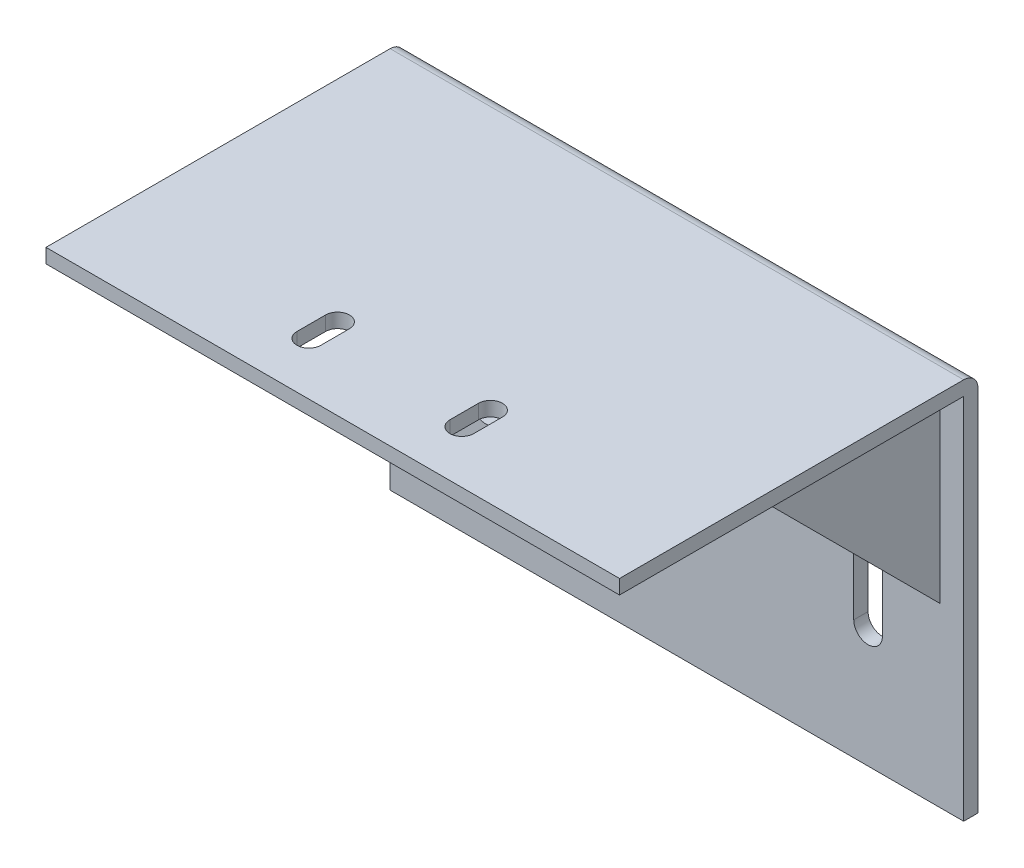
ISO-10303-21;
HEADER;
FILE_DESCRIPTION(('STEP AP214'),'2;1');
FILE_NAME('part.step','',(''),(''),'','','');
FILE_SCHEMA(('AUTOMOTIVE_DESIGN { 1 0 10303 214 1 1 1 1 }'));
ENDSEC;
DATA;
#1=APPLICATION_CONTEXT('core data for automotive mechanical design processes');
#2=APPLICATION_PROTOCOL_DEFINITION('international standard','automotive_design',2000,#1);
#3=PRODUCT_CONTEXT('',#1,'mechanical');
#4=PRODUCT('Part','Part','',(#3));
#5=PRODUCT_RELATED_PRODUCT_CATEGORY('part','',(#4));
#6=PRODUCT_DEFINITION_FORMATION('','',#4);
#7=PRODUCT_DEFINITION_CONTEXT('part definition',#1,'design');
#8=PRODUCT_DEFINITION('design','',#6,#7);
#9=PRODUCT_DEFINITION_SHAPE('','',#8);
#10=(LENGTH_UNIT() NAMED_UNIT(*) SI_UNIT(.MILLI.,.METRE.));
#11=(NAMED_UNIT(*) PLANE_ANGLE_UNIT() SI_UNIT($,.RADIAN.));
#12=(NAMED_UNIT(*) SI_UNIT($,.STERADIAN.) SOLID_ANGLE_UNIT());
#13=UNCERTAINTY_MEASURE_WITH_UNIT(LENGTH_MEASURE(1.E-05),#10,'distance_accuracy_value','');
#14=(GEOMETRIC_REPRESENTATION_CONTEXT(3) GLOBAL_UNCERTAINTY_ASSIGNED_CONTEXT((#13)) GLOBAL_UNIT_ASSIGNED_CONTEXT((#10,
#11,#12)) REPRESENTATION_CONTEXT('',''));
#15=CARTESIAN_POINT('',(0.,0.,0.));
#16=DIRECTION('',(0.,0.,1.));
#17=DIRECTION('',(1.,0.,0.));
#18=AXIS2_PLACEMENT_3D('',#15,#16,#17);
#19=CARTESIAN_POINT('',(0.,0.,3.));
#20=DIRECTION('',(0.,0.,-1.));
#21=DIRECTION('',(-1.,0.,0.));
#22=AXIS2_PLACEMENT_3D('',#19,#20,#21);
#23=PLANE('',#22);
#24=CARTESIAN_POINT('',(20.,25.,3.));
#25=DIRECTION('',(0.,0.,1.));
#26=DIRECTION('',(1.,0.,0.));
#27=AXIS2_PLACEMENT_3D('',#24,#25,#26);
#28=CIRCLE('',#27,3.);
#29=CARTESIAN_POINT('',(17.,25.,3.));
#30=VERTEX_POINT('',#29);
#31=CARTESIAN_POINT('',(23.,25.,3.));
#32=VERTEX_POINT('',#31);
#33=EDGE_CURVE('E288',#30,#32,#28,.T.);
#34=ORIENTED_EDGE('',*,*,#33,.F.);
#35=DIRECTION('',(0.,-1.,0.));
#36=VECTOR('',#35,1.);
#37=CARTESIAN_POINT('',(17.,55.,3.));
#38=LINE('',#37,#36);
#39=CARTESIAN_POINT('',(17.,55.,3.));
#40=VERTEX_POINT('',#39);
#41=EDGE_CURVE('E286',#40,#30,#38,.T.);
#42=ORIENTED_EDGE('',*,*,#41,.F.);
#43=CARTESIAN_POINT('',(20.,55.,3.));
#44=DIRECTION('',(0.,0.,1.));
#45=DIRECTION('',(1.,0.,0.));
#46=AXIS2_PLACEMENT_3D('',#43,#44,#45);
#47=CIRCLE('',#46,2.99999999999999);
#48=CARTESIAN_POINT('',(23.,55.,3.));
#49=VERTEX_POINT('',#48);
#50=EDGE_CURVE('E277',#49,#40,#47,.T.);
#51=ORIENTED_EDGE('',*,*,#50,.F.);
#52=DIRECTION('',(0.,1.,0.));
#53=VECTOR('',#52,1.);
#54=CARTESIAN_POINT('',(23.,55.,3.));
#55=LINE('',#54,#53);
#56=EDGE_CURVE('E291',#32,#49,#55,.T.);
#57=ORIENTED_EDGE('',*,*,#56,.F.);
#58=EDGE_LOOP('',(#34,#42,#51,#57));
#59=FACE_BOUND('',#58,.T.);
#60=CARTESIAN_POINT('',(100.,25.,3.));
#61=DIRECTION('',(0.,0.,1.));
#62=DIRECTION('',(1.,0.,0.));
#63=AXIS2_PLACEMENT_3D('',#60,#61,#62);
#64=CIRCLE('',#63,3.);
#65=CARTESIAN_POINT('',(97.,25.,3.));
#66=VERTEX_POINT('',#65);
#67=CARTESIAN_POINT('',(103.,24.9999999999999,3.));
#68=VERTEX_POINT('',#67);
#69=EDGE_CURVE('E256',#66,#68,#64,.T.);
#70=ORIENTED_EDGE('',*,*,#69,.F.);
#71=DIRECTION('',(0.,-1.,0.));
#72=VECTOR('',#71,1.);
#73=CARTESIAN_POINT('',(97.,55.,3.));
#74=LINE('',#73,#72);
#75=CARTESIAN_POINT('',(97.,55.,3.));
#76=VERTEX_POINT('',#75);
#77=EDGE_CURVE('E254',#76,#66,#74,.T.);
#78=ORIENTED_EDGE('',*,*,#77,.F.);
#79=CARTESIAN_POINT('',(100.,55.,3.));
#80=DIRECTION('',(0.,0.,1.));
#81=DIRECTION('',(1.,0.,0.));
#82=AXIS2_PLACEMENT_3D('',#79,#80,#81);
#83=CIRCLE('',#82,3.);
#84=CARTESIAN_POINT('',(103.,55.,3.));
#85=VERTEX_POINT('',#84);
#86=EDGE_CURVE('E249',#85,#76,#83,.T.);
#87=ORIENTED_EDGE('',*,*,#86,.F.);
#88=DIRECTION('',(0.,1.,0.));
#89=VECTOR('',#88,1.);
#90=CARTESIAN_POINT('',(103.,55.,3.));
#91=LINE('',#90,#89);
#92=EDGE_CURVE('E259',#68,#85,#91,.T.);
#93=ORIENTED_EDGE('',*,*,#92,.F.);
#94=EDGE_LOOP('',(#70,#78,#87,#93));
#95=FACE_BOUND('',#94,.T.);
#96=DIRECTION('',(0.,1.,0.));
#97=VECTOR('',#96,1.);
#98=CARTESIAN_POINT('',(115.,77.,3.));
#99=LINE('',#98,#97);
#100=CARTESIAN_POINT('',(115.,37.,3.));
#101=VERTEX_POINT('',#100);
#102=CARTESIAN_POINT('',(115.,77.,3.));
#103=VERTEX_POINT('',#102);
#104=EDGE_CURVE('E407',#101,#103,#99,.T.);
#105=ORIENTED_EDGE('',*,*,#104,.F.);
#106=DIRECTION('',(1.,0.,0.));
#107=VECTOR('',#106,1.);
#108=CARTESIAN_POINT('',(112.,37.,3.));
#109=LINE('',#108,#107);
#110=CARTESIAN_POINT('',(112.,37.,3.));
#111=VERTEX_POINT('',#110);
#112=EDGE_CURVE('E467',#111,#101,#109,.T.);
#113=ORIENTED_EDGE('',*,*,#112,.F.);
#114=DIRECTION('',(0.,-1.,0.));
#115=VECTOR('',#114,1.);
#116=CARTESIAN_POINT('',(112.,77.,3.));
#117=LINE('',#116,#115);
#118=CARTESIAN_POINT('',(112.,77.,3.));
#119=VERTEX_POINT('',#118);
#120=EDGE_CURVE('E461',#119,#111,#117,.T.);
#121=ORIENTED_EDGE('',*,*,#120,.F.);
#122=DIRECTION('',(1.,0.,0.));
#123=VECTOR('',#122,1.);
#124=CARTESIAN_POINT('',(0.,77.,3.));
#125=LINE('',#124,#123);
#126=CARTESIAN_POINT('',(8.,77.,3.));
#127=VERTEX_POINT('',#126);
#128=EDGE_CURVE('E328',#127,#119,#125,.T.);
#129=ORIENTED_EDGE('',*,*,#128,.F.);
#130=DIRECTION('',(0.,1.,0.));
#131=VECTOR('',#130,1.);
#132=CARTESIAN_POINT('',(8.,77.,3.));
#133=LINE('',#132,#131);
#134=CARTESIAN_POINT('',(8.00000000000001,37.,3.));
#135=VERTEX_POINT('',#134);
#136=EDGE_CURVE('E234',#135,#127,#133,.T.);
#137=ORIENTED_EDGE('',*,*,#136,.F.);
#138=DIRECTION('',(1.,0.,0.));
#139=VECTOR('',#138,1.);
#140=CARTESIAN_POINT('',(4.99999999999999,37.,3.));
#141=LINE('',#140,#139);
#142=CARTESIAN_POINT('',(4.99999999999999,37.,3.));
#143=VERTEX_POINT('',#142);
#144=EDGE_CURVE('E476',#143,#135,#141,.T.);
#145=ORIENTED_EDGE('',*,*,#144,.F.);
#146=DIRECTION('',(0.,-1.,0.));
#147=VECTOR('',#146,1.);
#148=CARTESIAN_POINT('',(4.99999999999999,77.,3.));
#149=LINE('',#148,#147);
#150=CARTESIAN_POINT('',(4.99999999999999,77.,3.));
#151=VERTEX_POINT('',#150);
#152=EDGE_CURVE('E239',#151,#143,#149,.T.);
#153=ORIENTED_EDGE('',*,*,#152,.F.);
#154=CARTESIAN_POINT('',(0.,77.,3.));
#155=VERTEX_POINT('',#154);
#156=EDGE_CURVE('E246',#155,#151,#125,.T.);
#157=ORIENTED_EDGE('',*,*,#156,.F.);
#158=DIRECTION('',(0.,-1.,0.));
#159=VECTOR('',#158,1.);
#160=CARTESIAN_POINT('',(0.,0.,3.));
#161=LINE('',#160,#159);
#162=CARTESIAN_POINT('',(0.,0.,3.));
#163=VERTEX_POINT('',#162);
#164=EDGE_CURVE('E353',#155,#163,#161,.T.);
#165=ORIENTED_EDGE('',*,*,#164,.T.);
#166=DIRECTION('',(1.,0.,0.));
#167=VECTOR('',#166,1.);
#168=CARTESIAN_POINT('',(0.,0.,3.));
#169=LINE('',#168,#167);
#170=CARTESIAN_POINT('',(120.,0.,3.));
#171=VERTEX_POINT('',#170);
#172=EDGE_CURVE('E355',#163,#171,#169,.T.);
#173=ORIENTED_EDGE('',*,*,#172,.T.);
#174=DIRECTION('',(0.,1.,0.));
#175=VECTOR('',#174,1.);
#176=CARTESIAN_POINT('',(120.,0.,3.));
#177=LINE('',#176,#175);
#178=CARTESIAN_POINT('',(120.,77.,3.));
#179=VERTEX_POINT('',#178);
#180=EDGE_CURVE('E357',#171,#179,#177,.T.);
#181=ORIENTED_EDGE('',*,*,#180,.T.);
#182=EDGE_CURVE('E309',#103,#179,#125,.T.);
#183=ORIENTED_EDGE('',*,*,#182,.F.);
#184=EDGE_LOOP('',(#105,#113,#121,#129,#137,#145,#153,#157,#165,#173,#181,#183));
#185=FACE_BOUND('',#184,.T.);
#186=ADVANCED_FACE('F33',(#59,#95,#185),#23,.F.);
#187=CARTESIAN_POINT('',(0.,77.,75.));
#188=DIRECTION('',(0.,1.,0.));
#189=DIRECTION('',(-1.,0.,0.));
#190=AXIS2_PLACEMENT_3D('',#187,#188,#189);
#191=PLANE('',#190);
#192=DIRECTION('',(0.,0.,-1.));
#193=VECTOR('',#192,1.);
#194=CARTESIAN_POINT('',(41.5,77.,64.));
#195=LINE('',#194,#193);
#196=CARTESIAN_POINT('',(41.5,77.,64.));
#197=VERTEX_POINT('',#196);
#198=CARTESIAN_POINT('',(41.5,77.,58.));
#199=VERTEX_POINT('',#198);
#200=EDGE_CURVE('E699',#197,#199,#195,.T.);
#201=ORIENTED_EDGE('',*,*,#200,.F.);
#202=CARTESIAN_POINT('',(44.,77.,64.));
#203=DIRECTION('',(0.,-1.,0.));
#204=DIRECTION('',(1.,0.,0.));
#205=AXIS2_PLACEMENT_3D('',#202,#203,#204);
#206=CIRCLE('',#205,2.5);
#207=CARTESIAN_POINT('',(46.5,77.,64.));
#208=VERTEX_POINT('',#207);
#209=EDGE_CURVE('E707',#208,#197,#206,.T.);
#210=ORIENTED_EDGE('',*,*,#209,.F.);
#211=DIRECTION('',(0.,0.,1.));
#212=VECTOR('',#211,1.);
#213=CARTESIAN_POINT('',(46.5,77.,64.));
#214=LINE('',#213,#212);
#215=CARTESIAN_POINT('',(46.5,77.,58.));
#216=VERTEX_POINT('',#215);
#217=EDGE_CURVE('E713',#216,#208,#214,.T.);
#218=ORIENTED_EDGE('',*,*,#217,.F.);
#219=CARTESIAN_POINT('',(44.,77.,58.));
#220=DIRECTION('',(0.,-1.,0.));
#221=DIRECTION('',(1.,0.,0.));
#222=AXIS2_PLACEMENT_3D('',#219,#220,#221);
#223=CIRCLE('',#222,2.5);
#224=EDGE_CURVE('E706',#199,#216,#223,.T.);
#225=ORIENTED_EDGE('',*,*,#224,.F.);
#226=EDGE_LOOP('',(#201,#210,#218,#225));
#227=FACE_BOUND('',#226,.T.);
#228=DIRECTION('',(0.,0.,-1.));
#229=VECTOR('',#228,1.);
#230=CARTESIAN_POINT('',(73.5,77.,64.));
#231=LINE('',#230,#229);
#232=CARTESIAN_POINT('',(73.5,77.,64.));
#233=VERTEX_POINT('',#232);
#234=CARTESIAN_POINT('',(73.5,77.,58.));
#235=VERTEX_POINT('',#234);
#236=EDGE_CURVE('E733',#233,#235,#231,.T.);
#237=ORIENTED_EDGE('',*,*,#236,.F.);
#238=CARTESIAN_POINT('',(76.,77.,64.));
#239=DIRECTION('',(0.,-1.,0.));
#240=DIRECTION('',(1.,0.,0.));
#241=AXIS2_PLACEMENT_3D('',#238,#239,#240);
#242=CIRCLE('',#241,2.50000000000002);
#243=CARTESIAN_POINT('',(78.5,77.,64.));
#244=VERTEX_POINT('',#243);
#245=EDGE_CURVE('E727',#244,#233,#242,.T.);
#246=ORIENTED_EDGE('',*,*,#245,.F.);
#247=DIRECTION('',(0.,0.,1.));
#248=VECTOR('',#247,1.);
#249=CARTESIAN_POINT('',(78.5,77.,64.));
#250=LINE('',#249,#248);
#251=CARTESIAN_POINT('',(78.5,77.,58.));
#252=VERTEX_POINT('',#251);
#253=EDGE_CURVE('E739',#252,#244,#250,.T.);
#254=ORIENTED_EDGE('',*,*,#253,.F.);
#255=CARTESIAN_POINT('',(76.,77.,58.));
#256=DIRECTION('',(0.,-1.,0.));
#257=DIRECTION('',(1.,0.,0.));
#258=AXIS2_PLACEMENT_3D('',#255,#256,#257);
#259=CIRCLE('',#258,2.50000000000002);
#260=EDGE_CURVE('E736',#235,#252,#259,.T.);
#261=ORIENTED_EDGE('',*,*,#260,.F.);
#262=EDGE_LOOP('',(#237,#246,#254,#261));
#263=FACE_BOUND('',#262,.T.);
#264=DIRECTION('',(-1.,0.,0.));
#265=VECTOR('',#264,1.);
#266=CARTESIAN_POINT('',(4.99999999999999,77.,43.));
#267=LINE('',#266,#265);
#268=CARTESIAN_POINT('',(8.,77.,43.));
#269=VERTEX_POINT('',#268);
#270=CARTESIAN_POINT('',(4.99999999999999,77.,43.));
#271=VERTEX_POINT('',#270);
#272=EDGE_CURVE('E222',#269,#271,#267,.T.);
#273=ORIENTED_EDGE('',*,*,#272,.F.);
#274=DIRECTION('',(0.,0.,-1.));
#275=VECTOR('',#274,1.);
#276=CARTESIAN_POINT('',(8.,77.,43.));
#277=LINE('',#276,#275);
#278=EDGE_CURVE('E247',#269,#127,#277,.T.);
#279=ORIENTED_EDGE('',*,*,#278,.T.);
#280=ORIENTED_EDGE('',*,*,#128,.T.);
#281=DIRECTION('',(0.,0.,-1.));
#282=VECTOR('',#281,1.);
#283=CARTESIAN_POINT('',(112.,77.,43.));
#284=LINE('',#283,#282);
#285=CARTESIAN_POINT('',(112.,77.,43.));
#286=VERTEX_POINT('',#285);
#287=EDGE_CURVE('E472',#286,#119,#284,.T.);
#288=ORIENTED_EDGE('',*,*,#287,.F.);
#289=DIRECTION('',(-1.,0.,0.));
#290=VECTOR('',#289,1.);
#291=CARTESIAN_POINT('',(112.,77.,43.));
#292=LINE('',#291,#290);
#293=CARTESIAN_POINT('',(115.,77.,43.));
#294=VERTEX_POINT('',#293);
#295=EDGE_CURVE('E470',#294,#286,#292,.T.);
#296=ORIENTED_EDGE('',*,*,#295,.F.);
#297=DIRECTION('',(0.,0.,-1.));
#298=VECTOR('',#297,1.);
#299=CARTESIAN_POINT('',(115.,77.,43.));
#300=LINE('',#299,#298);
#301=EDGE_CURVE('E403',#294,#103,#300,.T.);
#302=ORIENTED_EDGE('',*,*,#301,.T.);
#303=ORIENTED_EDGE('',*,*,#182,.T.);
#304=DIRECTION('',(0.,0.,-1.));
#305=VECTOR('',#304,1.);
#306=CARTESIAN_POINT('',(120.,77.,75.));
#307=LINE('',#306,#305);
#308=CARTESIAN_POINT('',(120.,77.,75.));
#309=VERTEX_POINT('',#308);
#310=EDGE_CURVE('E386',#309,#179,#307,.T.);
#311=ORIENTED_EDGE('',*,*,#310,.F.);
#312=DIRECTION('',(1.,0.,0.));
#313=VECTOR('',#312,1.);
#314=CARTESIAN_POINT('',(0.,77.,75.));
#315=LINE('',#314,#313);
#316=CARTESIAN_POINT('',(0.,77.,75.));
#317=VERTEX_POINT('',#316);
#318=EDGE_CURVE('E388',#317,#309,#315,.T.);
#319=ORIENTED_EDGE('',*,*,#318,.F.);
#320=DIRECTION('',(0.,0.,-1.));
#321=VECTOR('',#320,1.);
#322=CARTESIAN_POINT('',(0.,77.,75.));
#323=LINE('',#322,#321);
#324=EDGE_CURVE('E382',#317,#155,#323,.T.);
#325=ORIENTED_EDGE('',*,*,#324,.T.);
#326=ORIENTED_EDGE('',*,*,#156,.T.);
#327=DIRECTION('',(0.,0.,-1.));
#328=VECTOR('',#327,1.);
#329=CARTESIAN_POINT('',(4.99999999999999,77.,43.));
#330=LINE('',#329,#328);
#331=EDGE_CURVE('E233',#271,#151,#330,.T.);
#332=ORIENTED_EDGE('',*,*,#331,.F.);
#333=EDGE_LOOP('',(#273,#279,#280,#288,#296,#302,#303,#311,#319,#325,#326,#332));
#334=FACE_BOUND('',#333,.T.);
#335=ADVANCED_FACE('F244',(#227,#263,#334),#191,.F.);
#336=CARTESIAN_POINT('',(0.,0.,3.));
#337=DIRECTION('',(1.,0.,0.));
#338=DIRECTION('',(0.,0.,-1.));
#339=AXIS2_PLACEMENT_3D('',#336,#337,#338);
#340=PLANE('',#339);
#341=DIRECTION('',(0.,0.,-1.));
#342=VECTOR('',#341,1.);
#343=CARTESIAN_POINT('',(0.,80.,3.));
#344=LINE('',#343,#342);
#345=CARTESIAN_POINT('',(0.,80.,75.));
#346=VERTEX_POINT('',#345);
#347=CARTESIAN_POINT('',(0.,80.,3.));
#348=VERTEX_POINT('',#347);
#349=EDGE_CURVE('E365',#346,#348,#344,.T.);
#350=ORIENTED_EDGE('',*,*,#349,.T.);
#351=CARTESIAN_POINT('',(0.,77.,3.));
#352=DIRECTION('',(1.,0.,0.));
#353=DIRECTION('',(0.,0.,-1.));
#354=AXIS2_PLACEMENT_3D('',#351,#352,#353);
#355=CIRCLE('',#354,3.);
#356=CARTESIAN_POINT('',(0.,77.,0.));
#357=VERTEX_POINT('',#356);
#358=EDGE_CURVE('E55',#348,#357,#355,.F.);
#359=ORIENTED_EDGE('',*,*,#358,.T.);
#360=DIRECTION('',(0.,-1.,0.));
#361=VECTOR('',#360,1.);
#362=CARTESIAN_POINT('',(0.,0.,0.));
#363=LINE('',#362,#361);
#364=CARTESIAN_POINT('',(0.,0.,0.));
#365=VERTEX_POINT('',#364);
#366=EDGE_CURVE('E381',#357,#365,#363,.T.);
#367=ORIENTED_EDGE('',*,*,#366,.T.);
#368=DIRECTION('',(0.,0.,-1.));
#369=VECTOR('',#368,1.);
#370=CARTESIAN_POINT('',(0.,0.,3.));
#371=LINE('',#370,#369);
#372=EDGE_CURVE('E338',#163,#365,#371,.T.);
#373=ORIENTED_EDGE('',*,*,#372,.F.);
#374=ORIENTED_EDGE('',*,*,#164,.F.);
#375=ORIENTED_EDGE('',*,*,#324,.F.);
#376=DIRECTION('',(0.,-1.,0.));
#377=VECTOR('',#376,1.);
#378=CARTESIAN_POINT('',(0.,80.,75.));
#379=LINE('',#378,#377);
#380=EDGE_CURVE('E319',#346,#317,#379,.T.);
#381=ORIENTED_EDGE('',*,*,#380,.F.);
#382=EDGE_LOOP('',(#350,#359,#367,#373,#374,#375,#381));
#383=FACE_BOUND('',#382,.T.);
#384=ADVANCED_FACE('F35',(#383),#340,.F.);
#385=CARTESIAN_POINT('',(0.,0.,3.));
#386=DIRECTION('',(0.,1.,0.));
#387=DIRECTION('',(0.,0.,1.));
#388=AXIS2_PLACEMENT_3D('',#385,#386,#387);
#389=PLANE('',#388);
#390=DIRECTION('',(1.,0.,0.));
#391=VECTOR('',#390,1.);
#392=CARTESIAN_POINT('',(0.,0.,0.));
#393=LINE('',#392,#391);
#394=CARTESIAN_POINT('',(120.,0.,0.));
#395=VERTEX_POINT('',#394);
#396=EDGE_CURVE('E380',#365,#395,#393,.T.);
#397=ORIENTED_EDGE('',*,*,#396,.T.);
#398=DIRECTION('',(0.,0.,-1.));
#399=VECTOR('',#398,1.);
#400=CARTESIAN_POINT('',(120.,0.,3.));
#401=LINE('',#400,#399);
#402=EDGE_CURVE('E343',#171,#395,#401,.T.);
#403=ORIENTED_EDGE('',*,*,#402,.F.);
#404=ORIENTED_EDGE('',*,*,#172,.F.);
#405=ORIENTED_EDGE('',*,*,#372,.T.);
#406=EDGE_LOOP('',(#397,#403,#404,#405));
#407=FACE_BOUND('',#406,.T.);
#408=ADVANCED_FACE('F408',(#407),#389,.F.);
#409=CARTESIAN_POINT('',(120.,0.,3.));
#410=DIRECTION('',(-1.,0.,0.));
#411=DIRECTION('',(0.,0.,1.));
#412=AXIS2_PLACEMENT_3D('',#409,#410,#411);
#413=PLANE('',#412);
#414=DIRECTION('',(0.,1.,0.));
#415=VECTOR('',#414,1.);
#416=CARTESIAN_POINT('',(120.,0.,0.));
#417=LINE('',#416,#415);
#418=CARTESIAN_POINT('',(120.,77.,0.));
#419=VERTEX_POINT('',#418);
#420=EDGE_CURVE('E356',#395,#419,#417,.T.);
#421=ORIENTED_EDGE('',*,*,#420,.T.);
#422=CARTESIAN_POINT('',(120.,77.,3.));
#423=DIRECTION('',(-1.,0.,0.));
#424=DIRECTION('',(0.,0.,1.));
#425=AXIS2_PLACEMENT_3D('',#422,#423,#424);
#426=CIRCLE('',#425,3.);
#427=CARTESIAN_POINT('',(120.,80.,3.));
#428=VERTEX_POINT('',#427);
#429=EDGE_CURVE('E11',#419,#428,#426,.F.);
#430=ORIENTED_EDGE('',*,*,#429,.T.);
#431=DIRECTION('',(0.,0.,-1.));
#432=VECTOR('',#431,1.);
#433=CARTESIAN_POINT('',(120.,80.,3.));
#434=LINE('',#433,#432);
#435=CARTESIAN_POINT('',(120.,80.,75.));
#436=VERTEX_POINT('',#435);
#437=EDGE_CURVE('E349',#436,#428,#434,.T.);
#438=ORIENTED_EDGE('',*,*,#437,.F.);
#439=DIRECTION('',(0.,1.,0.));
#440=VECTOR('',#439,1.);
#441=CARTESIAN_POINT('',(120.,80.,75.));
#442=LINE('',#441,#440);
#443=EDGE_CURVE('E387',#309,#436,#442,.T.);
#444=ORIENTED_EDGE('',*,*,#443,.F.);
#445=ORIENTED_EDGE('',*,*,#310,.T.);
#446=ORIENTED_EDGE('',*,*,#180,.F.);
#447=ORIENTED_EDGE('',*,*,#402,.T.);
#448=EDGE_LOOP('',(#421,#430,#438,#444,#445,#446,#447));
#449=FACE_BOUND('',#448,.T.);
#450=ADVANCED_FACE('F376',(#449),#413,.F.);
#451=CARTESIAN_POINT('',(0.,80.,3.));
#452=DIRECTION('',(0.,-1.,0.));
#453=DIRECTION('',(1.,0.,0.));
#454=AXIS2_PLACEMENT_3D('',#451,#452,#453);
#455=PLANE('',#454);
#456=DIRECTION('',(0.,0.,1.));
#457=VECTOR('',#456,1.);
#458=CARTESIAN_POINT('',(46.5,80.,64.));
#459=LINE('',#458,#457);
#460=CARTESIAN_POINT('',(46.5,80.,58.));
#461=VERTEX_POINT('',#460);
#462=CARTESIAN_POINT('',(46.5,80.,64.));
#463=VERTEX_POINT('',#462);
#464=EDGE_CURVE('E439',#461,#463,#459,.T.);
#465=ORIENTED_EDGE('',*,*,#464,.T.);
#466=CARTESIAN_POINT('',(44.,80.,64.));
#467=DIRECTION('',(0.,-1.,0.));
#468=DIRECTION('',(1.,0.,0.));
#469=AXIS2_PLACEMENT_3D('',#466,#467,#468);
#470=CIRCLE('',#469,2.5);
#471=CARTESIAN_POINT('',(41.5,80.,64.));
#472=VERTEX_POINT('',#471);
#473=EDGE_CURVE('E715',#463,#472,#470,.T.);
#474=ORIENTED_EDGE('',*,*,#473,.T.);
#475=DIRECTION('',(0.,0.,-1.));
#476=VECTOR('',#475,1.);
#477=CARTESIAN_POINT('',(41.5,80.,64.));
#478=LINE('',#477,#476);
#479=CARTESIAN_POINT('',(41.5,80.,58.));
#480=VERTEX_POINT('',#479);
#481=EDGE_CURVE('E720',#472,#480,#478,.T.);
#482=ORIENTED_EDGE('',*,*,#481,.T.);
#483=CARTESIAN_POINT('',(44.,80.,58.));
#484=DIRECTION('',(0.,-1.,0.));
#485=DIRECTION('',(1.,0.,0.));
#486=AXIS2_PLACEMENT_3D('',#483,#484,#485);
#487=CIRCLE('',#486,2.5);
#488=EDGE_CURVE('E722',#480,#461,#487,.T.);
#489=ORIENTED_EDGE('',*,*,#488,.T.);
#490=EDGE_LOOP('',(#465,#474,#482,#489));
#491=FACE_BOUND('',#490,.T.);
#492=DIRECTION('',(0.,0.,1.));
#493=VECTOR('',#492,1.);
#494=CARTESIAN_POINT('',(78.5,80.,64.));
#495=LINE('',#494,#493);
#496=CARTESIAN_POINT('',(78.5,80.,58.));
#497=VERTEX_POINT('',#496);
#498=CARTESIAN_POINT('',(78.5,80.,64.));
#499=VERTEX_POINT('',#498);
#500=EDGE_CURVE('E444',#497,#499,#495,.T.);
#501=ORIENTED_EDGE('',*,*,#500,.T.);
#502=CARTESIAN_POINT('',(76.,80.,64.));
#503=DIRECTION('',(0.,-1.,0.));
#504=DIRECTION('',(1.,0.,0.));
#505=AXIS2_PLACEMENT_3D('',#502,#503,#504);
#506=CIRCLE('',#505,2.50000000000002);
#507=CARTESIAN_POINT('',(73.5,80.,64.));
#508=VERTEX_POINT('',#507);
#509=EDGE_CURVE('E447',#499,#508,#506,.T.);
#510=ORIENTED_EDGE('',*,*,#509,.T.);
#511=DIRECTION('',(0.,0.,-1.));
#512=VECTOR('',#511,1.);
#513=CARTESIAN_POINT('',(73.5,80.,64.));
#514=LINE('',#513,#512);
#515=CARTESIAN_POINT('',(73.5,80.,58.));
#516=VERTEX_POINT('',#515);
#517=EDGE_CURVE('E455',#508,#516,#514,.T.);
#518=ORIENTED_EDGE('',*,*,#517,.T.);
#519=CARTESIAN_POINT('',(76.,80.,58.));
#520=DIRECTION('',(0.,-1.,0.));
#521=DIRECTION('',(1.,0.,0.));
#522=AXIS2_PLACEMENT_3D('',#519,#520,#521);
#523=CIRCLE('',#522,2.50000000000002);
#524=EDGE_CURVE('E448',#516,#497,#523,.T.);
#525=ORIENTED_EDGE('',*,*,#524,.T.);
#526=EDGE_LOOP('',(#501,#510,#518,#525));
#527=FACE_BOUND('',#526,.T.);
#528=ORIENTED_EDGE('',*,*,#437,.T.);
#529=DIRECTION('',(-1.,0.,0.));
#530=VECTOR('',#529,1.);
#531=CARTESIAN_POINT('',(0.,80.,3.));
#532=LINE('',#531,#530);
#533=EDGE_CURVE('E335',#428,#348,#532,.T.);
#534=ORIENTED_EDGE('',*,*,#533,.T.);
#535=ORIENTED_EDGE('',*,*,#349,.F.);
#536=DIRECTION('',(-1.,0.,0.));
#537=VECTOR('',#536,1.);
#538=CARTESIAN_POINT('',(0.,80.,75.));
#539=LINE('',#538,#537);
#540=EDGE_CURVE('E369',#436,#346,#539,.T.);
#541=ORIENTED_EDGE('',*,*,#540,.F.);
#542=EDGE_LOOP('',(#528,#534,#535,#541));
#543=FACE_BOUND('',#542,.T.);
#544=ADVANCED_FACE('F367',(#491,#527,#543),#455,.F.);
#545=CARTESIAN_POINT('',(0.,0.,0.));
#546=DIRECTION('',(0.,0.,-1.));
#547=DIRECTION('',(-1.,0.,0.));
#548=AXIS2_PLACEMENT_3D('',#545,#546,#547);
#549=PLANE('',#548);
#550=CARTESIAN_POINT('',(100.,55.,0.));
#551=DIRECTION('',(0.,0.,1.));
#552=DIRECTION('',(1.,0.,0.));
#553=AXIS2_PLACEMENT_3D('',#550,#551,#552);
#554=CIRCLE('',#553,3.);
#555=CARTESIAN_POINT('',(103.,55.,0.));
#556=VERTEX_POINT('',#555);
#557=CARTESIAN_POINT('',(97.,55.,0.));
#558=VERTEX_POINT('',#557);
#559=EDGE_CURVE('E261',#556,#558,#554,.T.);
#560=ORIENTED_EDGE('',*,*,#559,.T.);
#561=DIRECTION('',(0.,-1.,0.));
#562=VECTOR('',#561,1.);
#563=CARTESIAN_POINT('',(97.,55.,0.));
#564=LINE('',#563,#562);
#565=CARTESIAN_POINT('',(97.,25.,0.));
#566=VERTEX_POINT('',#565);
#567=EDGE_CURVE('E264',#558,#566,#564,.T.);
#568=ORIENTED_EDGE('',*,*,#567,.T.);
#569=CARTESIAN_POINT('',(100.,25.,0.));
#570=DIRECTION('',(0.,0.,1.));
#571=DIRECTION('',(1.,0.,0.));
#572=AXIS2_PLACEMENT_3D('',#569,#570,#571);
#573=CIRCLE('',#572,3.);
#574=CARTESIAN_POINT('',(103.,24.9999999999999,0.));
#575=VERTEX_POINT('',#574);
#576=EDGE_CURVE('E267',#566,#575,#573,.T.);
#577=ORIENTED_EDGE('',*,*,#576,.T.);
#578=DIRECTION('',(0.,1.,0.));
#579=VECTOR('',#578,1.);
#580=CARTESIAN_POINT('',(103.,55.,0.));
#581=LINE('',#580,#579);
#582=EDGE_CURVE('E270',#575,#556,#581,.T.);
#583=ORIENTED_EDGE('',*,*,#582,.T.);
#584=EDGE_LOOP('',(#560,#568,#577,#583));
#585=FACE_BOUND('',#584,.T.);
#586=CARTESIAN_POINT('',(20.,55.,0.));
#587=DIRECTION('',(0.,0.,1.));
#588=DIRECTION('',(1.,0.,0.));
#589=AXIS2_PLACEMENT_3D('',#586,#587,#588);
#590=CIRCLE('',#589,2.99999999999999);
#591=CARTESIAN_POINT('',(23.,55.,0.));
#592=VERTEX_POINT('',#591);
#593=CARTESIAN_POINT('',(17.,55.,0.));
#594=VERTEX_POINT('',#593);
#595=EDGE_CURVE('E293',#592,#594,#590,.T.);
#596=ORIENTED_EDGE('',*,*,#595,.T.);
#597=DIRECTION('',(0.,-1.,0.));
#598=VECTOR('',#597,1.);
#599=CARTESIAN_POINT('',(17.,55.,0.));
#600=LINE('',#599,#598);
#601=CARTESIAN_POINT('',(17.,25.,0.));
#602=VERTEX_POINT('',#601);
#603=EDGE_CURVE('E296',#594,#602,#600,.T.);
#604=ORIENTED_EDGE('',*,*,#603,.T.);
#605=CARTESIAN_POINT('',(20.,25.,0.));
#606=DIRECTION('',(0.,0.,1.));
#607=DIRECTION('',(1.,0.,0.));
#608=AXIS2_PLACEMENT_3D('',#605,#606,#607);
#609=CIRCLE('',#608,3.);
#610=CARTESIAN_POINT('',(23.,25.,0.));
#611=VERTEX_POINT('',#610);
#612=EDGE_CURVE('E299',#602,#611,#609,.T.);
#613=ORIENTED_EDGE('',*,*,#612,.T.);
#614=DIRECTION('',(0.,1.,0.));
#615=VECTOR('',#614,1.);
#616=CARTESIAN_POINT('',(23.,55.,0.));
#617=LINE('',#616,#615);
#618=EDGE_CURVE('E302',#611,#592,#617,.T.);
#619=ORIENTED_EDGE('',*,*,#618,.T.);
#620=EDGE_LOOP('',(#596,#604,#613,#619));
#621=FACE_BOUND('',#620,.T.);
#622=ORIENTED_EDGE('',*,*,#366,.F.);
#623=DIRECTION('',(-1.,0.,0.));
#624=VECTOR('',#623,1.);
#625=CARTESIAN_POINT('',(120.,77.,0.));
#626=LINE('',#625,#624);
#627=EDGE_CURVE('E41',#357,#419,#626,.F.);
#628=ORIENTED_EDGE('',*,*,#627,.T.);
#629=ORIENTED_EDGE('',*,*,#420,.F.);
#630=ORIENTED_EDGE('',*,*,#396,.F.);
#631=EDGE_LOOP('',(#622,#628,#629,#630));
#632=FACE_BOUND('',#631,.T.);
#633=ADVANCED_FACE('F427',(#585,#621,#632),#549,.T.);
#634=CARTESIAN_POINT('',(0.,80.,75.));
#635=DIRECTION('',(0.,0.,1.));
#636=DIRECTION('',(1.,0.,0.));
#637=AXIS2_PLACEMENT_3D('',#634,#635,#636);
#638=PLANE('',#637);
#639=ORIENTED_EDGE('',*,*,#380,.T.);
#640=ORIENTED_EDGE('',*,*,#318,.T.);
#641=ORIENTED_EDGE('',*,*,#443,.T.);
#642=ORIENTED_EDGE('',*,*,#540,.T.);
#643=EDGE_LOOP('',(#639,#640,#641,#642));
#644=FACE_BOUND('',#643,.T.);
#645=ADVANCED_FACE('F394',(#644),#638,.T.);
#646=CARTESIAN_POINT('',(20.,55.,0.));
#647=DIRECTION('',(0.,0.,1.));
#648=DIRECTION('',(1.,0.,0.));
#649=AXIS2_PLACEMENT_3D('',#646,#647,#648);
#650=CYLINDRICAL_SURFACE('',#649,2.99999999999999);
#651=ORIENTED_EDGE('',*,*,#50,.T.);
#652=DIRECTION('',(0.,0.,1.));
#653=VECTOR('',#652,1.);
#654=CARTESIAN_POINT('',(17.,55.,0.));
#655=LINE('',#654,#653);
#656=EDGE_CURVE('E305',#594,#40,#655,.T.);
#657=ORIENTED_EDGE('',*,*,#656,.F.);
#658=ORIENTED_EDGE('',*,*,#595,.F.);
#659=DIRECTION('',(0.,0.,1.));
#660=VECTOR('',#659,1.);
#661=CARTESIAN_POINT('',(23.,55.,0.));
#662=LINE('',#661,#660);
#663=EDGE_CURVE('E306',#592,#49,#662,.T.);
#664=ORIENTED_EDGE('',*,*,#663,.T.);
#665=EDGE_LOOP('',(#651,#657,#658,#664));
#666=FACE_BOUND('',#665,.T.);
#667=ADVANCED_FACE('F531',(#666),#650,.F.);
#668=CARTESIAN_POINT('',(23.,55.,0.));
#669=DIRECTION('',(1.,0.,0.));
#670=DIRECTION('',(0.,1.,0.));
#671=AXIS2_PLACEMENT_3D('',#668,#669,#670);
#672=PLANE('',#671);
#673=ORIENTED_EDGE('',*,*,#56,.T.);
#674=ORIENTED_EDGE('',*,*,#663,.F.);
#675=ORIENTED_EDGE('',*,*,#618,.F.);
#676=DIRECTION('',(0.,0.,1.));
#677=VECTOR('',#676,1.);
#678=CARTESIAN_POINT('',(23.,25.,0.));
#679=LINE('',#678,#677);
#680=EDGE_CURVE('E310',#611,#32,#679,.T.);
#681=ORIENTED_EDGE('',*,*,#680,.T.);
#682=EDGE_LOOP('',(#673,#674,#675,#681));
#683=FACE_BOUND('',#682,.T.);
#684=ADVANCED_FACE('F527',(#683),#672,.F.);
#685=CARTESIAN_POINT('',(20.,25.,0.));
#686=DIRECTION('',(0.,0.,1.));
#687=DIRECTION('',(1.,0.,0.));
#688=AXIS2_PLACEMENT_3D('',#685,#686,#687);
#689=CYLINDRICAL_SURFACE('',#688,3.);
#690=ORIENTED_EDGE('',*,*,#33,.T.);
#691=ORIENTED_EDGE('',*,*,#680,.F.);
#692=ORIENTED_EDGE('',*,*,#612,.F.);
#693=DIRECTION('',(0.,0.,1.));
#694=VECTOR('',#693,1.);
#695=CARTESIAN_POINT('',(17.,25.,0.));
#696=LINE('',#695,#694);
#697=EDGE_CURVE('E312',#602,#30,#696,.T.);
#698=ORIENTED_EDGE('',*,*,#697,.T.);
#699=EDGE_LOOP('',(#690,#691,#692,#698));
#700=FACE_BOUND('',#699,.T.);
#701=ADVANCED_FACE('F530',(#700),#689,.F.);
#702=CARTESIAN_POINT('',(17.,55.,0.));
#703=DIRECTION('',(-1.,0.,0.));
#704=DIRECTION('',(0.,-1.,0.));
#705=AXIS2_PLACEMENT_3D('',#702,#703,#704);
#706=PLANE('',#705);
#707=ORIENTED_EDGE('',*,*,#41,.T.);
#708=ORIENTED_EDGE('',*,*,#697,.F.);
#709=ORIENTED_EDGE('',*,*,#603,.F.);
#710=ORIENTED_EDGE('',*,*,#656,.T.);
#711=EDGE_LOOP('',(#707,#708,#709,#710));
#712=FACE_BOUND('',#711,.T.);
#713=ADVANCED_FACE('F525',(#712),#706,.F.);
#714=CARTESIAN_POINT('',(100.,55.,0.));
#715=DIRECTION('',(0.,0.,1.));
#716=DIRECTION('',(1.,0.,0.));
#717=AXIS2_PLACEMENT_3D('',#714,#715,#716);
#718=CYLINDRICAL_SURFACE('',#717,3.);
#719=ORIENTED_EDGE('',*,*,#86,.T.);
#720=DIRECTION('',(0.,0.,1.));
#721=VECTOR('',#720,1.);
#722=CARTESIAN_POINT('',(97.,55.,0.));
#723=LINE('',#722,#721);
#724=EDGE_CURVE('E273',#558,#76,#723,.T.);
#725=ORIENTED_EDGE('',*,*,#724,.F.);
#726=ORIENTED_EDGE('',*,*,#559,.F.);
#727=DIRECTION('',(0.,0.,1.));
#728=VECTOR('',#727,1.);
#729=CARTESIAN_POINT('',(103.,55.,0.));
#730=LINE('',#729,#728);
#731=EDGE_CURVE('E274',#556,#85,#730,.T.);
#732=ORIENTED_EDGE('',*,*,#731,.T.);
#733=EDGE_LOOP('',(#719,#725,#726,#732));
#734=FACE_BOUND('',#733,.T.);
#735=ADVANCED_FACE('F515',(#734),#718,.F.);
#736=CARTESIAN_POINT('',(103.,55.,0.));
#737=DIRECTION('',(1.,0.,0.));
#738=DIRECTION('',(0.,0.,-1.));
#739=AXIS2_PLACEMENT_3D('',#736,#737,#738);
#740=PLANE('',#739);
#741=ORIENTED_EDGE('',*,*,#92,.T.);
#742=ORIENTED_EDGE('',*,*,#731,.F.);
#743=ORIENTED_EDGE('',*,*,#582,.F.);
#744=DIRECTION('',(0.,0.,1.));
#745=VECTOR('',#744,1.);
#746=CARTESIAN_POINT('',(103.,24.9999999999999,0.));
#747=LINE('',#746,#745);
#748=EDGE_CURVE('E278',#575,#68,#747,.T.);
#749=ORIENTED_EDGE('',*,*,#748,.T.);
#750=EDGE_LOOP('',(#741,#742,#743,#749));
#751=FACE_BOUND('',#750,.T.);
#752=ADVANCED_FACE('F511',(#751),#740,.F.);
#753=CARTESIAN_POINT('',(100.,25.,0.));
#754=DIRECTION('',(0.,0.,1.));
#755=DIRECTION('',(1.,0.,0.));
#756=AXIS2_PLACEMENT_3D('',#753,#754,#755);
#757=CYLINDRICAL_SURFACE('',#756,3.);
#758=ORIENTED_EDGE('',*,*,#69,.T.);
#759=ORIENTED_EDGE('',*,*,#748,.F.);
#760=ORIENTED_EDGE('',*,*,#576,.F.);
#761=DIRECTION('',(0.,0.,1.));
#762=VECTOR('',#761,1.);
#763=CARTESIAN_POINT('',(97.,25.,0.));
#764=LINE('',#763,#762);
#765=EDGE_CURVE('E280',#566,#66,#764,.T.);
#766=ORIENTED_EDGE('',*,*,#765,.T.);
#767=EDGE_LOOP('',(#758,#759,#760,#766));
#768=FACE_BOUND('',#767,.T.);
#769=ADVANCED_FACE('F514',(#768),#757,.F.);
#770=CARTESIAN_POINT('',(97.,55.,0.));
#771=DIRECTION('',(-1.,0.,0.));
#772=DIRECTION('',(0.,0.,1.));
#773=AXIS2_PLACEMENT_3D('',#770,#771,#772);
#774=PLANE('',#773);
#775=ORIENTED_EDGE('',*,*,#77,.T.);
#776=ORIENTED_EDGE('',*,*,#765,.F.);
#777=ORIENTED_EDGE('',*,*,#567,.F.);
#778=ORIENTED_EDGE('',*,*,#724,.T.);
#779=EDGE_LOOP('',(#775,#776,#777,#778));
#780=FACE_BOUND('',#779,.T.);
#781=ADVANCED_FACE('F510',(#780),#774,.F.);
#782=CARTESIAN_POINT('',(4.99999999999999,77.,43.));
#783=DIRECTION('',(1.,0.,0.));
#784=DIRECTION('',(0.,0.,-1.));
#785=AXIS2_PLACEMENT_3D('',#782,#783,#784);
#786=PLANE('',#785);
#787=ORIENTED_EDGE('',*,*,#152,.T.);
#788=DIRECTION('',(0.,-0.707106781186547,-0.707106781186548));
#789=VECTOR('',#788,1.);
#790=CARTESIAN_POINT('',(4.99999999999999,37.,3.));
#791=LINE('',#790,#789);
#792=EDGE_CURVE('E225',#271,#143,#791,.T.);
#793=ORIENTED_EDGE('',*,*,#792,.F.);
#794=ORIENTED_EDGE('',*,*,#331,.T.);
#795=EDGE_LOOP('',(#787,#793,#794));
#796=FACE_BOUND('',#795,.T.);
#797=ADVANCED_FACE('F237',(#796),#786,.F.);
#798=CARTESIAN_POINT('',(8.,77.,43.));
#799=DIRECTION('',(-1.,0.,0.));
#800=DIRECTION('',(0.,-1.,0.));
#801=AXIS2_PLACEMENT_3D('',#798,#799,#800);
#802=PLANE('',#801);
#803=ORIENTED_EDGE('',*,*,#278,.F.);
#804=DIRECTION('',(0.,-0.707106781186548,-0.707106781186548));
#805=VECTOR('',#804,1.);
#806=CARTESIAN_POINT('',(8.,77.,43.));
#807=LINE('',#806,#805);
#808=EDGE_CURVE('E228',#269,#135,#807,.T.);
#809=ORIENTED_EDGE('',*,*,#808,.T.);
#810=ORIENTED_EDGE('',*,*,#136,.T.);
#811=EDGE_LOOP('',(#803,#809,#810));
#812=FACE_BOUND('',#811,.T.);
#813=ADVANCED_FACE('F479',(#812),#802,.F.);
#814=CARTESIAN_POINT('',(112.,77.,43.));
#815=DIRECTION('',(1.,0.,0.));
#816=DIRECTION('',(0.,0.,-1.));
#817=AXIS2_PLACEMENT_3D('',#814,#815,#816);
#818=PLANE('',#817);
#819=ORIENTED_EDGE('',*,*,#120,.T.);
#820=DIRECTION('',(0.,0.707106781186548,0.707106781186548));
#821=VECTOR('',#820,1.);
#822=CARTESIAN_POINT('',(112.,77.,43.));
#823=LINE('',#822,#821);
#824=EDGE_CURVE('E486',#111,#286,#823,.T.);
#825=ORIENTED_EDGE('',*,*,#824,.T.);
#826=ORIENTED_EDGE('',*,*,#287,.T.);
#827=EDGE_LOOP('',(#819,#825,#826));
#828=FACE_BOUND('',#827,.T.);
#829=ADVANCED_FACE('F485',(#828),#818,.F.);
#830=CARTESIAN_POINT('',(115.,77.,43.));
#831=DIRECTION('',(-1.,0.,0.));
#832=DIRECTION('',(0.,0.,1.));
#833=AXIS2_PLACEMENT_3D('',#830,#831,#832);
#834=PLANE('',#833);
#835=ORIENTED_EDGE('',*,*,#301,.F.);
#836=DIRECTION('',(0.,-0.707106781186548,-0.707106781186548));
#837=VECTOR('',#836,1.);
#838=CARTESIAN_POINT('',(115.,77.,43.));
#839=LINE('',#838,#837);
#840=EDGE_CURVE('E241',#294,#101,#839,.T.);
#841=ORIENTED_EDGE('',*,*,#840,.T.);
#842=ORIENTED_EDGE('',*,*,#104,.T.);
#843=EDGE_LOOP('',(#835,#841,#842));
#844=FACE_BOUND('',#843,.T.);
#845=ADVANCED_FACE('F492',(#844),#834,.F.);
#846=CARTESIAN_POINT('',(76.,80.,64.));
#847=DIRECTION('',(0.,-1.,0.));
#848=DIRECTION('',(1.,0.,0.));
#849=AXIS2_PLACEMENT_3D('',#846,#847,#848);
#850=CYLINDRICAL_SURFACE('',#849,2.50000000000002);
#851=ORIENTED_EDGE('',*,*,#245,.T.);
#852=DIRECTION('',(0.,-1.,0.));
#853=VECTOR('',#852,1.);
#854=CARTESIAN_POINT('',(73.5,80.,64.));
#855=LINE('',#854,#853);
#856=EDGE_CURVE('E450',#508,#233,#855,.T.);
#857=ORIENTED_EDGE('',*,*,#856,.F.);
#858=ORIENTED_EDGE('',*,*,#509,.F.);
#859=DIRECTION('',(0.,-1.,0.));
#860=VECTOR('',#859,1.);
#861=CARTESIAN_POINT('',(78.5,80.,64.));
#862=LINE('',#861,#860);
#863=EDGE_CURVE('E459',#499,#244,#862,.T.);
#864=ORIENTED_EDGE('',*,*,#863,.T.);
#865=EDGE_LOOP('',(#851,#857,#858,#864));
#866=FACE_BOUND('',#865,.T.);
#867=ADVANCED_FACE('F494',(#866),#850,.F.);
#868=CARTESIAN_POINT('',(78.5,80.,64.));
#869=DIRECTION('',(1.,0.,0.));
#870=DIRECTION('',(0.,1.,0.));
#871=AXIS2_PLACEMENT_3D('',#868,#869,#870);
#872=PLANE('',#871);
#873=ORIENTED_EDGE('',*,*,#253,.T.);
#874=ORIENTED_EDGE('',*,*,#863,.F.);
#875=ORIENTED_EDGE('',*,*,#500,.F.);
#876=DIRECTION('',(0.,-1.,0.));
#877=VECTOR('',#876,1.);
#878=CARTESIAN_POINT('',(78.5,80.,58.));
#879=LINE('',#878,#877);
#880=EDGE_CURVE('E462',#497,#252,#879,.T.);
#881=ORIENTED_EDGE('',*,*,#880,.T.);
#882=EDGE_LOOP('',(#873,#874,#875,#881));
#883=FACE_BOUND('',#882,.T.);
#884=ADVANCED_FACE('F500',(#883),#872,.F.);
#885=CARTESIAN_POINT('',(76.,80.,58.));
#886=DIRECTION('',(0.,-1.,0.));
#887=DIRECTION('',(1.,0.,0.));
#888=AXIS2_PLACEMENT_3D('',#885,#886,#887);
#889=CYLINDRICAL_SURFACE('',#888,2.50000000000002);
#890=ORIENTED_EDGE('',*,*,#260,.T.);
#891=ORIENTED_EDGE('',*,*,#880,.F.);
#892=ORIENTED_EDGE('',*,*,#524,.F.);
#893=DIRECTION('',(0.,-1.,0.));
#894=VECTOR('',#893,1.);
#895=CARTESIAN_POINT('',(73.5,80.,58.));
#896=LINE('',#895,#894);
#897=EDGE_CURVE('E453',#516,#235,#896,.T.);
#898=ORIENTED_EDGE('',*,*,#897,.T.);
#899=EDGE_LOOP('',(#890,#891,#892,#898));
#900=FACE_BOUND('',#899,.T.);
#901=ADVANCED_FACE('F610',(#900),#889,.F.);
#902=CARTESIAN_POINT('',(73.5,80.,64.));
#903=DIRECTION('',(-1.,0.,0.));
#904=DIRECTION('',(0.,-1.,0.));
#905=AXIS2_PLACEMENT_3D('',#902,#903,#904);
#906=PLANE('',#905);
#907=ORIENTED_EDGE('',*,*,#236,.T.);
#908=ORIENTED_EDGE('',*,*,#897,.F.);
#909=ORIENTED_EDGE('',*,*,#517,.F.);
#910=ORIENTED_EDGE('',*,*,#856,.T.);
#911=EDGE_LOOP('',(#907,#908,#909,#910));
#912=FACE_BOUND('',#911,.T.);
#913=ADVANCED_FACE('F620',(#912),#906,.F.);
#914=CARTESIAN_POINT('',(44.,80.,64.));
#915=DIRECTION('',(0.,-1.,0.));
#916=DIRECTION('',(1.,0.,0.));
#917=AXIS2_PLACEMENT_3D('',#914,#915,#916);
#918=CYLINDRICAL_SURFACE('',#917,2.5);
#919=ORIENTED_EDGE('',*,*,#209,.T.);
#920=DIRECTION('',(0.,-1.,0.));
#921=VECTOR('',#920,1.);
#922=CARTESIAN_POINT('',(41.5,80.,64.));
#923=LINE('',#922,#921);
#924=EDGE_CURVE('E704',#472,#197,#923,.T.);
#925=ORIENTED_EDGE('',*,*,#924,.F.);
#926=ORIENTED_EDGE('',*,*,#473,.F.);
#927=DIRECTION('',(0.,-1.,0.));
#928=VECTOR('',#927,1.);
#929=CARTESIAN_POINT('',(46.5,80.,64.));
#930=LINE('',#929,#928);
#931=EDGE_CURVE('E725',#463,#208,#930,.T.);
#932=ORIENTED_EDGE('',*,*,#931,.T.);
#933=EDGE_LOOP('',(#919,#925,#926,#932));
#934=FACE_BOUND('',#933,.T.);
#935=ADVANCED_FACE('F629',(#934),#918,.F.);
#936=CARTESIAN_POINT('',(46.5,80.,64.));
#937=DIRECTION('',(1.,0.,0.));
#938=DIRECTION('',(0.,1.,0.));
#939=AXIS2_PLACEMENT_3D('',#936,#937,#938);
#940=PLANE('',#939);
#941=ORIENTED_EDGE('',*,*,#217,.T.);
#942=ORIENTED_EDGE('',*,*,#931,.F.);
#943=ORIENTED_EDGE('',*,*,#464,.F.);
#944=DIRECTION('',(0.,-1.,0.));
#945=VECTOR('',#944,1.);
#946=CARTESIAN_POINT('',(46.5,80.,58.));
#947=LINE('',#946,#945);
#948=EDGE_CURVE('E728',#461,#216,#947,.T.);
#949=ORIENTED_EDGE('',*,*,#948,.T.);
#950=EDGE_LOOP('',(#941,#942,#943,#949));
#951=FACE_BOUND('',#950,.T.);
#952=ADVANCED_FACE('F638',(#951),#940,.F.);
#953=CARTESIAN_POINT('',(44.,80.,58.));
#954=DIRECTION('',(0.,-1.,0.));
#955=DIRECTION('',(1.,0.,0.));
#956=AXIS2_PLACEMENT_3D('',#953,#954,#955);
#957=CYLINDRICAL_SURFACE('',#956,2.5);
#958=ORIENTED_EDGE('',*,*,#224,.T.);
#959=ORIENTED_EDGE('',*,*,#948,.F.);
#960=ORIENTED_EDGE('',*,*,#488,.F.);
#961=DIRECTION('',(0.,-1.,0.));
#962=VECTOR('',#961,1.);
#963=CARTESIAN_POINT('',(41.5,80.,58.));
#964=LINE('',#963,#962);
#965=EDGE_CURVE('E702',#480,#199,#964,.T.);
#966=ORIENTED_EDGE('',*,*,#965,.T.);
#967=EDGE_LOOP('',(#958,#959,#960,#966));
#968=FACE_BOUND('',#967,.T.);
#969=ADVANCED_FACE('F649',(#968),#957,.F.);
#970=CARTESIAN_POINT('',(41.5,80.,64.));
#971=DIRECTION('',(-1.,0.,0.));
#972=DIRECTION('',(0.,-1.,0.));
#973=AXIS2_PLACEMENT_3D('',#970,#971,#972);
#974=PLANE('',#973);
#975=ORIENTED_EDGE('',*,*,#200,.T.);
#976=ORIENTED_EDGE('',*,*,#965,.F.);
#977=ORIENTED_EDGE('',*,*,#481,.F.);
#978=ORIENTED_EDGE('',*,*,#924,.T.);
#979=EDGE_LOOP('',(#975,#976,#977,#978));
#980=FACE_BOUND('',#979,.T.);
#981=ADVANCED_FACE('F660',(#980),#974,.F.);
#982=CARTESIAN_POINT('',(120.00005,37.,3.));
#983=DIRECTION('',(0.,0.707106781186548,-0.707106781186548));
#984=DIRECTION('',(0.,0.707106781186548,0.707106781186548));
#985=AXIS2_PLACEMENT_3D('',#982,#983,#984);
#986=PLANE('',#985);
#987=ORIENTED_EDGE('',*,*,#112,.T.);
#988=ORIENTED_EDGE('',*,*,#840,.F.);
#989=ORIENTED_EDGE('',*,*,#295,.T.);
#990=ORIENTED_EDGE('',*,*,#824,.F.);
#991=EDGE_LOOP('',(#987,#988,#989,#990));
#992=FACE_BOUND('',#991,.T.);
#993=ADVANCED_FACE('F488',(#992),#986,.F.);
#994=ORIENTED_EDGE('',*,*,#272,.T.);
#995=ORIENTED_EDGE('',*,*,#792,.T.);
#996=ORIENTED_EDGE('',*,*,#144,.T.);
#997=ORIENTED_EDGE('',*,*,#808,.F.);
#998=EDGE_LOOP('',(#994,#995,#996,#997));
#999=FACE_BOUND('',#998,.T.);
#1000=ADVANCED_FACE('F224',(#999),#986,.F.);
#1001=CARTESIAN_POINT('',(0.,77.,3.));
#1002=DIRECTION('',(1.,0.,0.));
#1003=DIRECTION('',(0.,1.,0.));
#1004=AXIS2_PLACEMENT_3D('',#1001,#1002,#1003);
#1005=CYLINDRICAL_SURFACE('',#1004,3.);
#1006=ORIENTED_EDGE('',*,*,#429,.F.);
#1007=ORIENTED_EDGE('',*,*,#627,.F.);
#1008=ORIENTED_EDGE('',*,*,#358,.F.);
#1009=ORIENTED_EDGE('',*,*,#533,.F.);
#1010=EDGE_LOOP('',(#1006,#1007,#1008,#1009));
#1011=FACE_BOUND('',#1010,.T.);
#1012=ADVANCED_FACE('F375',(#1011),#1005,.T.);
#1013=CLOSED_SHELL('',(#186,#335,#384,#408,#450,#544,#633,#645,#667,#684,#701,#713,#735,#752,
#769,#781,#797,#813,#829,#845,#867,#884,#901,#913,#935,#952,#969,#981,#993,#1000,#1012));
#1014=MANIFOLD_SOLID_BREP('B2',#1013);
#1015=ADVANCED_BREP_SHAPE_REPRESENTATION('',(#18,#1014),#14);
#1016=SHAPE_DEFINITION_REPRESENTATION(#9,#1015);
ENDSEC;
END-ISO-10303-21;
